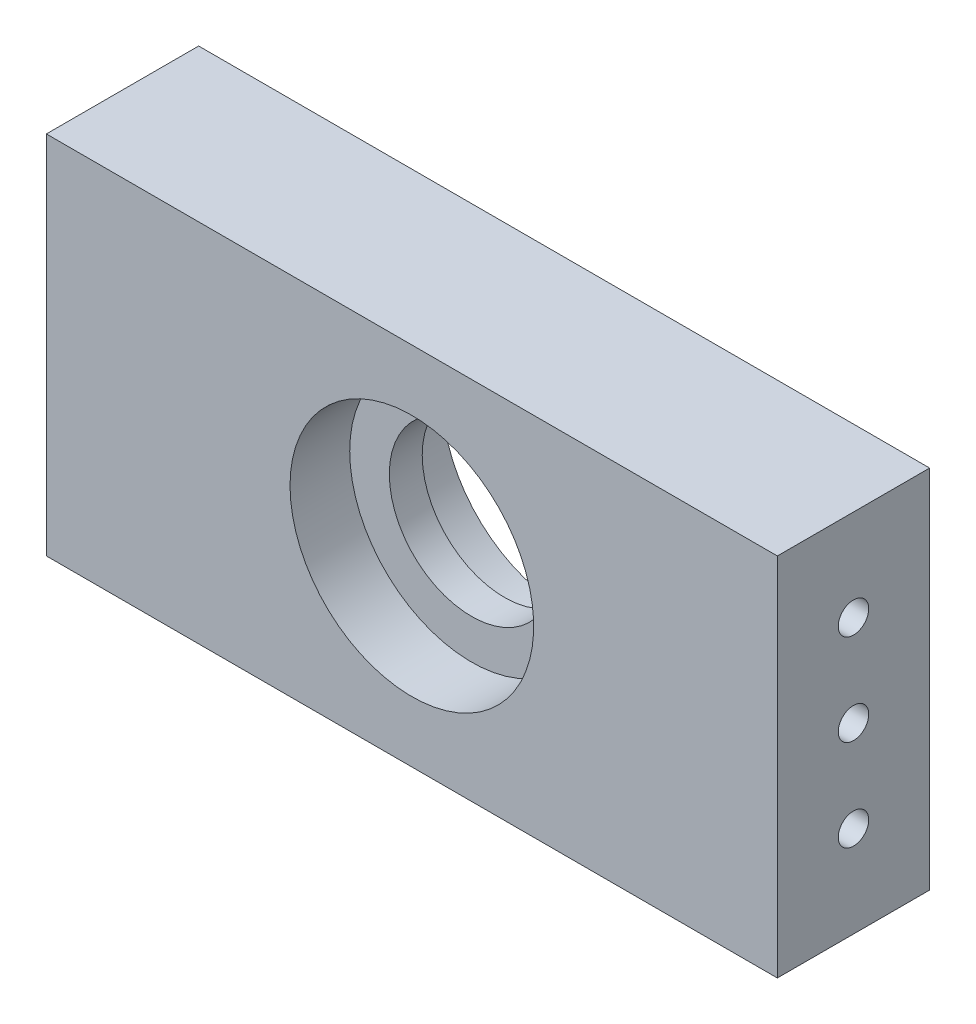
ISO-10303-21;
HEADER;
FILE_DESCRIPTION(('STEP AP214'),'2;1');
FILE_NAME('part.step','',(''),(''),'','','');
FILE_SCHEMA(('AUTOMOTIVE_DESIGN { 1 0 10303 214 1 1 1 1 }'));
ENDSEC;
DATA;
#1=APPLICATION_CONTEXT('core data for automotive mechanical design processes');
#2=APPLICATION_PROTOCOL_DEFINITION('international standard','automotive_design',2000,#1);
#3=PRODUCT_CONTEXT('',#1,'mechanical');
#4=PRODUCT('Part','Part','',(#3));
#5=PRODUCT_RELATED_PRODUCT_CATEGORY('part','',(#4));
#6=PRODUCT_DEFINITION_FORMATION('','',#4);
#7=PRODUCT_DEFINITION_CONTEXT('part definition',#1,'design');
#8=PRODUCT_DEFINITION('design','',#6,#7);
#9=PRODUCT_DEFINITION_SHAPE('','',#8);
#10=(LENGTH_UNIT() NAMED_UNIT(*) SI_UNIT(.MILLI.,.METRE.));
#11=(NAMED_UNIT(*) PLANE_ANGLE_UNIT() SI_UNIT($,.RADIAN.));
#12=(NAMED_UNIT(*) SI_UNIT($,.STERADIAN.) SOLID_ANGLE_UNIT());
#13=UNCERTAINTY_MEASURE_WITH_UNIT(LENGTH_MEASURE(1.E-05),#10,'distance_accuracy_value','');
#14=(GEOMETRIC_REPRESENTATION_CONTEXT(3) GLOBAL_UNCERTAINTY_ASSIGNED_CONTEXT((#13)) GLOBAL_UNIT_ASSIGNED_CONTEXT((#10,
#11,#12)) REPRESENTATION_CONTEXT('',''));
#15=CARTESIAN_POINT('',(0.,0.,0.));
#16=DIRECTION('',(0.,0.,1.));
#17=DIRECTION('',(1.,0.,0.));
#18=AXIS2_PLACEMENT_3D('',#15,#16,#17);
#19=CARTESIAN_POINT('',(76.2,38.1,31.75));
#20=DIRECTION('',(0.,0.,-1.));
#21=DIRECTION('',(-1.,0.,0.));
#22=AXIS2_PLACEMENT_3D('',#19,#20,#21);
#23=CYLINDRICAL_SURFACE('',#22,17.145);
#24=CARTESIAN_POINT('',(76.2,38.1,12.446));
#25=DIRECTION('',(0.,0.,-1.));
#26=DIRECTION('',(-1.,0.,0.));
#27=AXIS2_PLACEMENT_3D('',#24,#25,#26);
#28=CIRCLE('',#27,17.145);
#29=CARTESIAN_POINT('',(59.055,38.1,12.446));
#30=VERTEX_POINT('',#29);
#31=EDGE_CURVE('E123',#30,#30,#28,.T.);
#32=ORIENTED_EDGE('',*,*,#31,.T.);
#33=EDGE_LOOP('',(#32));
#34=FACE_BOUND('',#33,.T.);
#35=CARTESIAN_POINT('',(76.2,38.1,19.304));
#36=DIRECTION('',(0.,0.,-1.));
#37=DIRECTION('',(-1.,0.,0.));
#38=AXIS2_PLACEMENT_3D('',#35,#36,#37);
#39=CIRCLE('',#38,17.145);
#40=CARTESIAN_POINT('',(59.055,38.1,19.304));
#41=VERTEX_POINT('',#40);
#42=EDGE_CURVE('E132',#41,#41,#39,.T.);
#43=ORIENTED_EDGE('',*,*,#42,.F.);
#44=EDGE_LOOP('',(#43));
#45=FACE_BOUND('',#44,.T.);
#46=ADVANCED_FACE('F41',(#34,#45),#23,.F.);
#47=CARTESIAN_POINT('',(0.,0.,31.75));
#48=DIRECTION('',(0.,0.,-1.));
#49=DIRECTION('',(-1.,0.,0.));
#50=AXIS2_PLACEMENT_3D('',#47,#48,#49);
#51=PLANE('',#50);
#52=DIRECTION('',(0.,-1.,0.));
#53=VECTOR('',#52,1.);
#54=CARTESIAN_POINT('',(0.,0.,31.75));
#55=LINE('',#54,#53);
#56=CARTESIAN_POINT('',(0.,76.2,31.75));
#57=VERTEX_POINT('',#56);
#58=CARTESIAN_POINT('',(0.,0.,31.75));
#59=VERTEX_POINT('',#58);
#60=EDGE_CURVE('E94',#57,#59,#55,.T.);
#61=ORIENTED_EDGE('',*,*,#60,.T.);
#62=DIRECTION('',(1.,0.,0.));
#63=VECTOR('',#62,1.);
#64=CARTESIAN_POINT('',(0.,0.,31.75));
#65=LINE('',#64,#63);
#66=CARTESIAN_POINT('',(152.4,0.,31.75));
#67=VERTEX_POINT('',#66);
#68=EDGE_CURVE('E88',#59,#67,#65,.T.);
#69=ORIENTED_EDGE('',*,*,#68,.T.);
#70=DIRECTION('',(0.,1.,0.));
#71=VECTOR('',#70,1.);
#72=CARTESIAN_POINT('',(152.4,0.,31.75));
#73=LINE('',#72,#71);
#74=CARTESIAN_POINT('',(152.4,76.2,31.75));
#75=VERTEX_POINT('',#74);
#76=EDGE_CURVE('E92',#67,#75,#73,.T.);
#77=ORIENTED_EDGE('',*,*,#76,.T.);
#78=DIRECTION('',(-1.,0.,0.));
#79=VECTOR('',#78,1.);
#80=CARTESIAN_POINT('',(0.,76.2,31.75));
#81=LINE('',#80,#79);
#82=EDGE_CURVE('E58',#75,#57,#81,.T.);
#83=ORIENTED_EDGE('',*,*,#82,.T.);
#84=EDGE_LOOP('',(#61,#69,#77,#83));
#85=FACE_BOUND('',#84,.T.);
#86=CARTESIAN_POINT('',(76.2,38.1,31.75));
#87=DIRECTION('',(0.,0.,-1.));
#88=DIRECTION('',(-1.,0.,0.));
#89=AXIS2_PLACEMENT_3D('',#86,#87,#88);
#90=CIRCLE('',#89,25.4);
#91=CARTESIAN_POINT('',(50.8,38.1,31.75));
#92=VERTEX_POINT('',#91);
#93=EDGE_CURVE('E129',#92,#92,#90,.T.);
#94=ORIENTED_EDGE('',*,*,#93,.T.);
#95=EDGE_LOOP('',(#94));
#96=FACE_BOUND('',#95,.T.);
#97=ADVANCED_FACE('F89',(#85,#96),#51,.F.);
#98=CARTESIAN_POINT('',(0.,0.,31.75));
#99=DIRECTION('',(1.,0.,0.));
#100=DIRECTION('',(0.,1.,0.));
#101=AXIS2_PLACEMENT_3D('',#98,#99,#100);
#102=PLANE('',#101);
#103=DIRECTION('',(0.,-1.,0.));
#104=VECTOR('',#103,1.);
#105=CARTESIAN_POINT('',(0.,0.,0.));
#106=LINE('',#105,#104);
#107=CARTESIAN_POINT('',(0.,76.2,0.));
#108=VERTEX_POINT('',#107);
#109=CARTESIAN_POINT('',(0.,0.,0.));
#110=VERTEX_POINT('',#109);
#111=EDGE_CURVE('E106',#108,#110,#106,.T.);
#112=ORIENTED_EDGE('',*,*,#111,.T.);
#113=DIRECTION('',(0.,0.,-1.));
#114=VECTOR('',#113,1.);
#115=CARTESIAN_POINT('',(0.,0.,31.75));
#116=LINE('',#115,#114);
#117=EDGE_CURVE('E11',#59,#110,#116,.T.);
#118=ORIENTED_EDGE('',*,*,#117,.F.);
#119=ORIENTED_EDGE('',*,*,#60,.F.);
#120=DIRECTION('',(0.,0.,-1.));
#121=VECTOR('',#120,1.);
#122=CARTESIAN_POINT('',(0.,76.2,31.75));
#123=LINE('',#122,#121);
#124=EDGE_CURVE('E102',#57,#108,#123,.T.);
#125=ORIENTED_EDGE('',*,*,#124,.T.);
#126=EDGE_LOOP('',(#112,#118,#119,#125));
#127=FACE_BOUND('',#126,.T.);
#128=ADVANCED_FACE('F43',(#127),#102,.F.);
#129=CARTESIAN_POINT('',(0.,0.,31.75));
#130=DIRECTION('',(0.,1.,0.));
#131=DIRECTION('',(0.,0.,1.));
#132=AXIS2_PLACEMENT_3D('',#129,#130,#131);
#133=PLANE('',#132);
#134=DIRECTION('',(1.,0.,0.));
#135=VECTOR('',#134,1.);
#136=CARTESIAN_POINT('',(0.,0.,0.));
#137=LINE('',#136,#135);
#138=CARTESIAN_POINT('',(152.4,0.,0.));
#139=VERTEX_POINT('',#138);
#140=EDGE_CURVE('E98',#110,#139,#137,.T.);
#141=ORIENTED_EDGE('',*,*,#140,.T.);
#142=DIRECTION('',(0.,0.,-1.));
#143=VECTOR('',#142,1.);
#144=CARTESIAN_POINT('',(152.4,0.,31.75));
#145=LINE('',#144,#143);
#146=EDGE_CURVE('E50',#67,#139,#145,.T.);
#147=ORIENTED_EDGE('',*,*,#146,.F.);
#148=ORIENTED_EDGE('',*,*,#68,.F.);
#149=ORIENTED_EDGE('',*,*,#117,.T.);
#150=EDGE_LOOP('',(#141,#147,#148,#149));
#151=FACE_BOUND('',#150,.T.);
#152=ADVANCED_FACE('F97',(#151),#133,.F.);
#153=CARTESIAN_POINT('',(152.4,0.,31.75));
#154=DIRECTION('',(-1.,0.,0.));
#155=DIRECTION('',(0.,-1.,0.));
#156=AXIS2_PLACEMENT_3D('',#153,#154,#155);
#157=PLANE('',#156);
#158=CARTESIAN_POINT('',(152.4,57.15,15.875));
#159=DIRECTION('',(1.,0.,0.));
#160=DIRECTION('',(0.,1.,0.));
#161=AXIS2_PLACEMENT_3D('',#158,#159,#160);
#162=CIRCLE('',#161,3.175);
#163=CARTESIAN_POINT('',(152.4,60.325,15.875));
#164=VERTEX_POINT('',#163);
#165=EDGE_CURVE('E150',#164,#164,#162,.T.);
#166=ORIENTED_EDGE('',*,*,#165,.F.);
#167=EDGE_LOOP('',(#166));
#168=FACE_BOUND('',#167,.T.);
#169=CARTESIAN_POINT('',(152.4,19.05,15.875));
#170=DIRECTION('',(1.,0.,0.));
#171=DIRECTION('',(0.,1.,0.));
#172=AXIS2_PLACEMENT_3D('',#169,#170,#171);
#173=CIRCLE('',#172,3.175);
#174=CARTESIAN_POINT('',(152.4,22.225,15.875));
#175=VERTEX_POINT('',#174);
#176=EDGE_CURVE('E147',#175,#175,#173,.T.);
#177=ORIENTED_EDGE('',*,*,#176,.F.);
#178=EDGE_LOOP('',(#177));
#179=FACE_BOUND('',#178,.T.);
#180=CARTESIAN_POINT('',(152.4,38.1,15.875));
#181=DIRECTION('',(1.,0.,0.));
#182=DIRECTION('',(0.,1.,0.));
#183=AXIS2_PLACEMENT_3D('',#180,#181,#182);
#184=CIRCLE('',#183,3.175);
#185=CARTESIAN_POINT('',(152.4,41.275,15.875));
#186=VERTEX_POINT('',#185);
#187=EDGE_CURVE('E141',#186,#186,#184,.T.);
#188=ORIENTED_EDGE('',*,*,#187,.F.);
#189=EDGE_LOOP('',(#188));
#190=FACE_BOUND('',#189,.T.);
#191=DIRECTION('',(0.,1.,0.));
#192=VECTOR('',#191,1.);
#193=CARTESIAN_POINT('',(152.4,0.,0.));
#194=LINE('',#193,#192);
#195=CARTESIAN_POINT('',(152.4,76.2,0.));
#196=VERTEX_POINT('',#195);
#197=EDGE_CURVE('E75',#139,#196,#194,.T.);
#198=ORIENTED_EDGE('',*,*,#197,.T.);
#199=DIRECTION('',(0.,0.,-1.));
#200=VECTOR('',#199,1.);
#201=CARTESIAN_POINT('',(152.4,76.2,31.75));
#202=LINE('',#201,#200);
#203=EDGE_CURVE('E99',#75,#196,#202,.T.);
#204=ORIENTED_EDGE('',*,*,#203,.F.);
#205=ORIENTED_EDGE('',*,*,#76,.F.);
#206=ORIENTED_EDGE('',*,*,#146,.T.);
#207=EDGE_LOOP('',(#198,#204,#205,#206));
#208=FACE_BOUND('',#207,.T.);
#209=ADVANCED_FACE('F100',(#168,#179,#190,#208),#157,.F.);
#210=CARTESIAN_POINT('',(0.,76.2,31.75));
#211=DIRECTION('',(0.,-1.,0.));
#212=DIRECTION('',(0.,0.,-1.));
#213=AXIS2_PLACEMENT_3D('',#210,#211,#212);
#214=PLANE('',#213);
#215=DIRECTION('',(-1.,0.,0.));
#216=VECTOR('',#215,1.);
#217=CARTESIAN_POINT('',(0.,76.2,0.));
#218=LINE('',#217,#216);
#219=EDGE_CURVE('E81',#196,#108,#218,.T.);
#220=ORIENTED_EDGE('',*,*,#219,.T.);
#221=ORIENTED_EDGE('',*,*,#124,.F.);
#222=ORIENTED_EDGE('',*,*,#82,.F.);
#223=ORIENTED_EDGE('',*,*,#203,.T.);
#224=EDGE_LOOP('',(#220,#221,#222,#223));
#225=FACE_BOUND('',#224,.T.);
#226=ADVANCED_FACE('F114',(#225),#214,.F.);
#227=CARTESIAN_POINT('',(0.,0.,0.));
#228=DIRECTION('',(0.,0.,-1.));
#229=DIRECTION('',(-1.,0.,0.));
#230=AXIS2_PLACEMENT_3D('',#227,#228,#229);
#231=PLANE('',#230);
#232=CARTESIAN_POINT('',(76.2,38.1,0.));
#233=DIRECTION('',(0.,0.,-1.));
#234=DIRECTION('',(-1.,0.,0.));
#235=AXIS2_PLACEMENT_3D('',#232,#233,#234);
#236=CIRCLE('',#235,25.4);
#237=CARTESIAN_POINT('',(50.8,38.1,0.));
#238=VERTEX_POINT('',#237);
#239=EDGE_CURVE('E120',#238,#238,#236,.T.);
#240=ORIENTED_EDGE('',*,*,#239,.F.);
#241=EDGE_LOOP('',(#240));
#242=FACE_BOUND('',#241,.T.);
#243=ORIENTED_EDGE('',*,*,#111,.F.);
#244=ORIENTED_EDGE('',*,*,#219,.F.);
#245=ORIENTED_EDGE('',*,*,#197,.F.);
#246=ORIENTED_EDGE('',*,*,#140,.F.);
#247=EDGE_LOOP('',(#243,#244,#245,#246));
#248=FACE_BOUND('',#247,.T.);
#249=ADVANCED_FACE('F117',(#242,#248),#231,.T.);
#250=CARTESIAN_POINT('',(76.2,38.1,12.446));
#251=DIRECTION('',(0.,0.,-1.));
#252=DIRECTION('',(-1.,0.,0.));
#253=AXIS2_PLACEMENT_3D('',#250,#251,#252);
#254=CYLINDRICAL_SURFACE('',#253,25.4);
#255=CARTESIAN_POINT('',(76.2,38.1,12.446));
#256=DIRECTION('',(0.,0.,-1.));
#257=DIRECTION('',(-1.,0.,0.));
#258=AXIS2_PLACEMENT_3D('',#255,#256,#257);
#259=CIRCLE('',#258,25.4);
#260=CARTESIAN_POINT('',(50.8,38.1,12.446));
#261=VERTEX_POINT('',#260);
#262=EDGE_CURVE('E109',#261,#261,#259,.T.);
#263=ORIENTED_EDGE('',*,*,#262,.F.);
#264=EDGE_LOOP('',(#263));
#265=FACE_BOUND('',#264,.T.);
#266=ORIENTED_EDGE('',*,*,#239,.T.);
#267=EDGE_LOOP('',(#266));
#268=FACE_BOUND('',#267,.T.);
#269=ADVANCED_FACE('F200',(#265,#268),#254,.F.);
#270=CARTESIAN_POINT('',(76.2,38.1,12.446));
#271=DIRECTION('',(0.,0.,-1.));
#272=DIRECTION('',(-1.,0.,0.));
#273=AXIS2_PLACEMENT_3D('',#270,#271,#272);
#274=PLANE('',#273);
#275=ORIENTED_EDGE('',*,*,#31,.F.);
#276=EDGE_LOOP('',(#275));
#277=FACE_BOUND('',#276,.T.);
#278=ORIENTED_EDGE('',*,*,#262,.T.);
#279=EDGE_LOOP('',(#278));
#280=FACE_BOUND('',#279,.T.);
#281=ADVANCED_FACE('F233',(#277,#280),#274,.T.);
#282=CARTESIAN_POINT('',(76.2,38.1,19.304));
#283=DIRECTION('',(0.,0.,1.));
#284=DIRECTION('',(-1.,0.,0.));
#285=AXIS2_PLACEMENT_3D('',#282,#283,#284);
#286=PLANE('',#285);
#287=CARTESIAN_POINT('',(76.2,38.1,19.304));
#288=DIRECTION('',(0.,0.,-1.));
#289=DIRECTION('',(-1.,0.,0.));
#290=AXIS2_PLACEMENT_3D('',#287,#288,#289);
#291=CIRCLE('',#290,25.4);
#292=CARTESIAN_POINT('',(50.8,38.1,19.304));
#293=VERTEX_POINT('',#292);
#294=EDGE_CURVE('E128',#293,#293,#291,.T.);
#295=ORIENTED_EDGE('',*,*,#294,.F.);
#296=EDGE_LOOP('',(#295));
#297=FACE_BOUND('',#296,.T.);
#298=ORIENTED_EDGE('',*,*,#42,.T.);
#299=EDGE_LOOP('',(#298));
#300=FACE_BOUND('',#299,.T.);
#301=ADVANCED_FACE('F186',(#297,#300),#286,.T.);
#302=CARTESIAN_POINT('',(76.2,38.1,19.304));
#303=DIRECTION('',(0.,0.,1.));
#304=DIRECTION('',(1.,0.,0.));
#305=AXIS2_PLACEMENT_3D('',#302,#303,#304);
#306=CYLINDRICAL_SURFACE('',#305,25.4);
#307=ORIENTED_EDGE('',*,*,#294,.T.);
#308=EDGE_LOOP('',(#307));
#309=FACE_BOUND('',#308,.T.);
#310=ORIENTED_EDGE('',*,*,#93,.F.);
#311=EDGE_LOOP('',(#310));
#312=FACE_BOUND('',#311,.T.);
#313=ADVANCED_FACE('F175',(#309,#312),#306,.F.);
#314=CARTESIAN_POINT('',(120.65,38.1,15.875));
#315=DIRECTION('',(1.,0.,0.));
#316=DIRECTION('',(0.,1.,0.));
#317=AXIS2_PLACEMENT_3D('',#314,#315,#316);
#318=CYLINDRICAL_SURFACE('',#317,3.175);
#319=CARTESIAN_POINT('',(120.65,38.1,15.875));
#320=DIRECTION('',(1.,0.,0.));
#321=DIRECTION('',(0.,1.,0.));
#322=AXIS2_PLACEMENT_3D('',#319,#320,#321);
#323=CIRCLE('',#322,3.175);
#324=CARTESIAN_POINT('',(120.65,41.275,15.875));
#325=VERTEX_POINT('',#324);
#326=EDGE_CURVE('E138',#325,#325,#323,.T.);
#327=ORIENTED_EDGE('',*,*,#326,.F.);
#328=EDGE_LOOP('',(#327));
#329=FACE_BOUND('',#328,.T.);
#330=ORIENTED_EDGE('',*,*,#187,.T.);
#331=EDGE_LOOP('',(#330));
#332=FACE_BOUND('',#331,.T.);
#333=ADVANCED_FACE('F172',(#329,#332),#318,.F.);
#334=CARTESIAN_POINT('',(120.65,38.1,15.875));
#335=DIRECTION('',(1.,0.,0.));
#336=DIRECTION('',(0.,1.,0.));
#337=AXIS2_PLACEMENT_3D('',#334,#335,#336);
#338=PLANE('',#337);
#339=ORIENTED_EDGE('',*,*,#326,.T.);
#340=EDGE_LOOP('',(#339));
#341=FACE_BOUND('',#340,.T.);
#342=ADVANCED_FACE('F174',(#341),#338,.T.);
#343=CARTESIAN_POINT('',(120.65,19.05,15.875));
#344=DIRECTION('',(1.,0.,0.));
#345=DIRECTION('',(0.,1.,0.));
#346=AXIS2_PLACEMENT_3D('',#343,#344,#345);
#347=CYLINDRICAL_SURFACE('',#346,3.175);
#348=CARTESIAN_POINT('',(120.65,19.05,15.875));
#349=DIRECTION('',(1.,0.,0.));
#350=DIRECTION('',(0.,1.,0.));
#351=AXIS2_PLACEMENT_3D('',#348,#349,#350);
#352=CIRCLE('',#351,3.175);
#353=CARTESIAN_POINT('',(120.65,22.225,15.875));
#354=VERTEX_POINT('',#353);
#355=EDGE_CURVE('E144',#354,#354,#352,.T.);
#356=ORIENTED_EDGE('',*,*,#355,.F.);
#357=EDGE_LOOP('',(#356));
#358=FACE_BOUND('',#357,.T.);
#359=ORIENTED_EDGE('',*,*,#176,.T.);
#360=EDGE_LOOP('',(#359));
#361=FACE_BOUND('',#360,.T.);
#362=ADVANCED_FACE('F182',(#358,#361),#347,.F.);
#363=CARTESIAN_POINT('',(120.65,19.05,15.875));
#364=DIRECTION('',(1.,0.,0.));
#365=DIRECTION('',(0.,1.,0.));
#366=AXIS2_PLACEMENT_3D('',#363,#364,#365);
#367=PLANE('',#366);
#368=ORIENTED_EDGE('',*,*,#355,.T.);
#369=EDGE_LOOP('',(#368));
#370=FACE_BOUND('',#369,.T.);
#371=ADVANCED_FACE('F161',(#370),#367,.T.);
#372=CARTESIAN_POINT('',(120.65,57.15,15.875));
#373=DIRECTION('',(1.,0.,0.));
#374=DIRECTION('',(0.,1.,0.));
#375=AXIS2_PLACEMENT_3D('',#372,#373,#374);
#376=CYLINDRICAL_SURFACE('',#375,3.175);
#377=CARTESIAN_POINT('',(120.65,57.15,15.875));
#378=DIRECTION('',(1.,0.,0.));
#379=DIRECTION('',(0.,1.,0.));
#380=AXIS2_PLACEMENT_3D('',#377,#378,#379);
#381=CIRCLE('',#380,3.175);
#382=CARTESIAN_POINT('',(120.65,60.325,15.875));
#383=VERTEX_POINT('',#382);
#384=EDGE_CURVE('E137',#383,#383,#381,.T.);
#385=ORIENTED_EDGE('',*,*,#384,.F.);
#386=EDGE_LOOP('',(#385));
#387=FACE_BOUND('',#386,.T.);
#388=ORIENTED_EDGE('',*,*,#165,.T.);
#389=EDGE_LOOP('',(#388));
#390=FACE_BOUND('',#389,.T.);
#391=ADVANCED_FACE('F158',(#387,#390),#376,.F.);
#392=CARTESIAN_POINT('',(120.65,57.15,15.875));
#393=DIRECTION('',(1.,0.,0.));
#394=DIRECTION('',(0.,1.,0.));
#395=AXIS2_PLACEMENT_3D('',#392,#393,#394);
#396=PLANE('',#395);
#397=ORIENTED_EDGE('',*,*,#384,.T.);
#398=EDGE_LOOP('',(#397));
#399=FACE_BOUND('',#398,.T.);
#400=ADVANCED_FACE('F156',(#399),#396,.T.);
#401=CLOSED_SHELL('',(#46,#97,#128,#152,#209,#226,#249,#269,#281,#301,#313,#333,#342,#362,#371,
#391,#400));
#402=MANIFOLD_SOLID_BREP('B2',#401);
#403=ADVANCED_BREP_SHAPE_REPRESENTATION('',(#18,#402),#14);
#404=SHAPE_DEFINITION_REPRESENTATION(#9,#403);
ENDSEC;
END-ISO-10303-21;
